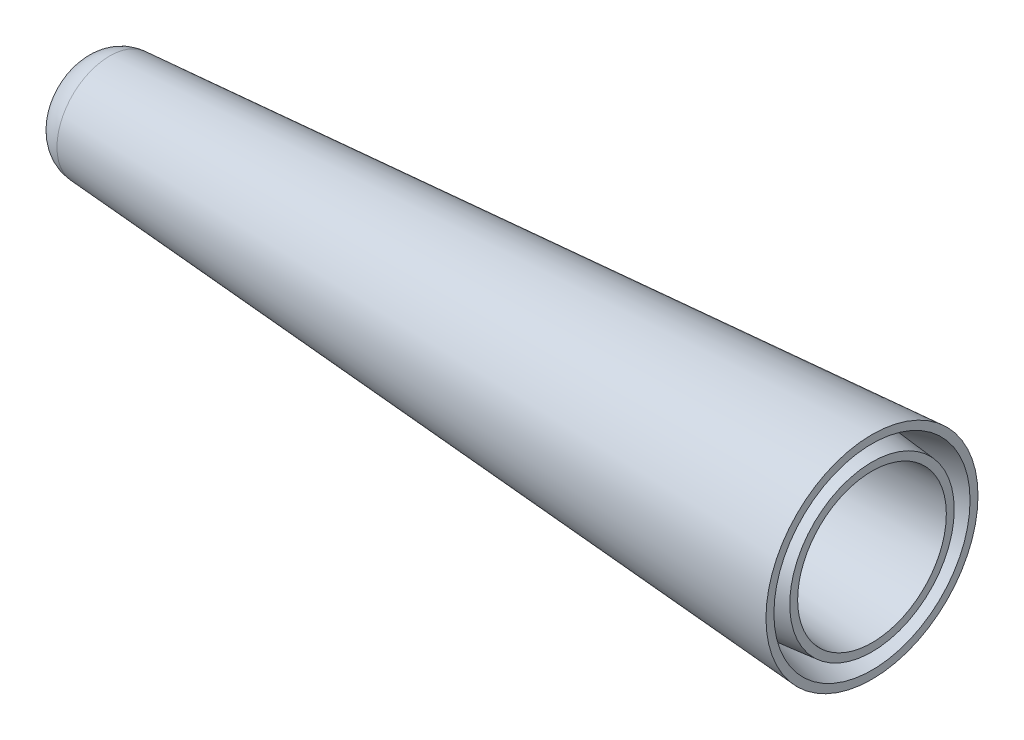
ISO-10303-21;
HEADER;
FILE_DESCRIPTION(('STEP AP214'),'2;1');
FILE_NAME('part.step','',(''),(''),'','','');
FILE_SCHEMA(('AUTOMOTIVE_DESIGN { 1 0 10303 214 1 1 1 1 }'));
ENDSEC;
DATA;
#1=APPLICATION_CONTEXT('core data for automotive mechanical design processes');
#2=APPLICATION_PROTOCOL_DEFINITION('international standard','automotive_design',2000,#1);
#3=PRODUCT_CONTEXT('',#1,'mechanical');
#4=PRODUCT('Part','Part','',(#3));
#5=PRODUCT_RELATED_PRODUCT_CATEGORY('part','',(#4));
#6=PRODUCT_DEFINITION_FORMATION('','',#4);
#7=PRODUCT_DEFINITION_CONTEXT('part definition',#1,'design');
#8=PRODUCT_DEFINITION('design','',#6,#7);
#9=PRODUCT_DEFINITION_SHAPE('','',#8);
#10=(LENGTH_UNIT() NAMED_UNIT(*) SI_UNIT(.MILLI.,.METRE.));
#11=(NAMED_UNIT(*) PLANE_ANGLE_UNIT() SI_UNIT($,.RADIAN.));
#12=(NAMED_UNIT(*) SI_UNIT($,.STERADIAN.) SOLID_ANGLE_UNIT());
#13=UNCERTAINTY_MEASURE_WITH_UNIT(LENGTH_MEASURE(1.E-05),#10,'distance_accuracy_value','');
#14=(GEOMETRIC_REPRESENTATION_CONTEXT(3) GLOBAL_UNCERTAINTY_ASSIGNED_CONTEXT((#13)) GLOBAL_UNIT_ASSIGNED_CONTEXT((#10,
#11,#12)) REPRESENTATION_CONTEXT('',''));
#15=CARTESIAN_POINT('',(0.,0.,0.));
#16=DIRECTION('',(0.,0.,1.));
#17=DIRECTION('',(1.,0.,0.));
#18=AXIS2_PLACEMENT_3D('',#15,#16,#17);
#19=CARTESIAN_POINT('',(50.,0.,0.));
#20=DIRECTION('',(1.,0.,0.));
#21=DIRECTION('',(0.,0.,-1.));
#22=AXIS2_PLACEMENT_3D('',#19,#20,#21);
#23=PLANE('',#22);
#24=CARTESIAN_POINT('',(50.,0.,0.));
#25=DIRECTION('',(1.,0.,0.));
#26=DIRECTION('',(0.,0.,-1.));
#27=AXIS2_PLACEMENT_3D('',#24,#25,#26);
#28=CIRCLE('',#27,6.69634059717554);
#29=CARTESIAN_POINT('',(50.,0.,-6.69634059717554));
#30=VERTEX_POINT('',#29);
#31=EDGE_CURVE('E79',#30,#30,#28,.T.);
#32=ORIENTED_EDGE('',*,*,#31,.T.);
#33=EDGE_LOOP('',(#32));
#34=FACE_BOUND('',#33,.T.);
#35=CARTESIAN_POINT('',(50.,0.,0.));
#36=DIRECTION('',(1.,0.,0.));
#37=DIRECTION('',(0.,0.,-1.));
#38=AXIS2_PLACEMENT_3D('',#35,#36,#37);
#39=CIRCLE('',#38,6.19511964813495);
#40=CARTESIAN_POINT('',(50.,0.,-6.19511964813495));
#41=VERTEX_POINT('',#40);
#42=EDGE_CURVE('E74',#41,#41,#39,.T.);
#43=ORIENTED_EDGE('',*,*,#42,.F.);
#44=EDGE_LOOP('',(#43));
#45=FACE_BOUND('',#44,.T.);
#46=ADVANCED_FACE('F44',(#34,#45),#23,.T.);
#47=CARTESIAN_POINT('',(50.,0.,-4.69512150857789));
#48=CARTESIAN_POINT('',(50.,-0.0775124416546671,-4.69512746288594));
#49=CARTESIAN_POINT('',(50.,-0.155028968040738,-4.69327686297905));
#50=CARTESIAN_POINT('',(50.,-0.30931134481741,-4.68582497437604));
#51=CARTESIAN_POINT('',(50.,-0.386078533048034,-4.68025127508642));
#52=CARTESIAN_POINT('',(50.,-0.538863254456393,-4.66535462510893));
#53=CARTESIAN_POINT('',(50.,-0.614882616948982,-4.65605051101887));
#54=CARTESIAN_POINT('',(50.,-0.766170717343436,-4.63370393037967));
#55=CARTESIAN_POINT('',(50.,-0.841440881345585,-4.62067112333707));
#56=CARTESIAN_POINT('',(50.,-0.991231339343665,-4.59087602482301));
#57=CARTESIAN_POINT('',(50.,-1.06575171069198,-4.57411412227401));
#58=CARTESIAN_POINT('',(50.,-1.21404396412532,-4.53687015375063));
#59=CARTESIAN_POINT('',(50.,-1.28781365743628,-4.51637937743146));
#60=CARTESIAN_POINT('',(50.,-1.43460737198423,-4.47168724214362));
#61=CARTESIAN_POINT('',(50.,-1.50762610167962,-4.4474685138979));
#62=CARTESIAN_POINT('',(50.,-1.65291974233676,-4.3953269502958));
#63=CARTESIAN_POINT('',(50.,-1.72518553597382,-4.36737874474295));
#64=CARTESIAN_POINT('',(50.,-1.86838013387628,-4.30804340648466));
#65=CARTESIAN_POINT('',(50.,-1.93930745247348,-4.27665268882305));
#66=CARTESIAN_POINT('',(50.,-2.07902804785243,-4.21069465735085));
#67=CARTESIAN_POINT('',(50.,-2.1478332545029,-4.17615264309091));
#68=CARTESIAN_POINT('',(50.,-2.28331023043661,-4.1038981770988));
#69=CARTESIAN_POINT('',(50.,-2.34999106743636,-4.06620273602421));
#70=CARTESIAN_POINT('',(50.,-2.48122277844722,-3.98765044707204));
#71=CARTESIAN_POINT('',(50.,-2.54577886178754,-3.94680230449715));
#72=CARTESIAN_POINT('',(50.,-2.67276507601446,-3.86195288319106));
#73=CARTESIAN_POINT('',(50.,-2.73519564748175,-3.81795226385479));
#74=CARTESIAN_POINT('',(50.,-2.85793564706415,-3.72680584703739));
#75=CARTESIAN_POINT('',(50.,-2.91823996076967,-3.67965316403947));
#76=CARTESIAN_POINT('',(50.,-3.03673378737065,-3.58221052759914));
#77=CARTESIAN_POINT('',(50.,-3.09491202106806,-3.53190686304264));
#78=CARTESIAN_POINT('',(50.,-3.20915750219905,-3.42816717417008));
#79=CARTESIAN_POINT('',(50.,-3.26520688012512,-3.37471148813813));
#80=CARTESIAN_POINT('',(50.,-3.37477531937602,-3.26511532154274));
#81=CARTESIAN_POINT('',(50.,-3.42829067725442,-3.20897113882781));
#82=CARTESIAN_POINT('',(50.,-3.53213446099675,-3.09456493858304));
#83=CARTESIAN_POINT('',(50.,-3.58248358815557,-3.03632172725161));
#84=CARTESIAN_POINT('',(50.,-3.67999745111359,-2.91772255544339));
#85=CARTESIAN_POINT('',(50.,-3.727177074484,-2.85737884109502));
#86=CARTESIAN_POINT('',(50.,-3.81835869480001,-2.73458577560312));
#87=CARTESIAN_POINT('',(50.,-3.86236883585799,-2.67214247353147));
#88=CARTESIAN_POINT('',(50.,-3.94721833551027,-2.54515631269986));
#89=CARTESIAN_POINT('',(50.,-3.98805835348872,-2.48061389453961));
#90=CARTESIAN_POINT('',(50.,-4.06657510242948,-2.34943502039702));
#91=CARTESIAN_POINT('',(50.,-4.10424447332359,-2.28279416022981));
#92=CARTESIAN_POINT('',(50.,-4.17642881210893,-2.14742327878113));
#93=CARTESIAN_POINT('',(50.,-4.21092811236186,-2.07868490644233));
#94=CARTESIAN_POINT('',(50.,-4.27677771378797,-1.93912207827003));
#95=CARTESIAN_POINT('',(50.,-4.30810398147676,-1.86828629574486));
#96=CARTESIAN_POINT('',(50.,-4.36739138271999,-1.72510261419097));
#97=CARTESIAN_POINT('',(50.,-4.39534767798401,-1.6527527120678));
#98=CARTESIAN_POINT('',(50.,-4.44750546696408,-1.50731586967257));
#99=CARTESIAN_POINT('',(50.,-4.47173328300328,-1.43423838201966));
#100=CARTESIAN_POINT('',(50.,-4.51643840698428,-1.28735009483453));
#101=CARTESIAN_POINT('',(50.,-4.53693415563886,-1.21354491202286));
#102=CARTESIAN_POINT('',(50.,-4.57418411661665,-1.06520521664913));
#103=CARTESIAN_POINT('',(50.,-4.59094816799818,-0.990673176083897));
#104=CARTESIAN_POINT('',(50.,-4.62074338418093,-0.840882763418078));
#105=CARTESIAN_POINT('',(50.,-4.63377532678387,-0.765624546043157));
#106=CARTESIAN_POINT('',(50.,-4.65611536227887,-0.6143840101421));
#107=CARTESIAN_POINT('',(50.,-4.66541496994597,-0.538400439255876));
#108=CARTESIAN_POINT('',(50.,-4.68030040956254,-0.385710302058013));
#109=CARTESIAN_POINT('',(50.,-4.68586857069038,-0.309002016121043));
#110=CARTESIAN_POINT('',(50.,-4.69329728755643,-0.154863224179588));
#111=CARTESIAN_POINT('',(50.,-4.69513130471307,-0.077431450892796));
#112=CARTESIAN_POINT('',(50.,-4.69511169854175,0.0775413280883679));
#113=CARTESIAN_POINT('',(50.,-4.69325283866525,0.15508233286712));
#114=CARTESIAN_POINT('',(50.,-4.68578408232483,0.309408376540803));
#115=CARTESIAN_POINT('',(50.,-4.68020212187726,0.386194755471347));
#116=CARTESIAN_POINT('',(50.,-4.66529255700744,0.539009747856804));
#117=CARTESIAN_POINT('',(50.,-4.65598413900821,0.615040229093841));
#118=CARTESIAN_POINT('',(50.,-4.63363147176082,0.766343180431094));
#119=CARTESIAN_POINT('',(50.,-4.6205972586095,0.84161713194866));
#120=CARTESIAN_POINT('',(50.,-4.59080213975315,0.991407563973905));
#121=CARTESIAN_POINT('',(50.,-4.57404201185416,1.06592419918554));
#122=CARTESIAN_POINT('',(50.,-4.53680426601222,1.21420139625289));
#123=CARTESIAN_POINT('',(50.,-4.51631832948614,1.28795986798344));
#124=CARTESIAN_POINT('',(50.,-4.47163869668915,1.43472357168149));
#125=CARTESIAN_POINT('',(50.,-4.44742801663569,1.50772363004496));
#126=CARTESIAN_POINT('',(50.,-4.39530489414029,1.65297215195386));
#127=CARTESIAN_POINT('',(50.,-4.36736744827808,1.72521163043999));
#128=CARTESIAN_POINT('',(50.,-4.30804381955395,1.86838030608011));
#129=CARTESIAN_POINT('',(50.,-4.27665279910239,1.9393074984478));
#130=CARTESIAN_POINT('',(50.,-4.21069454788966,2.07902800221964));
#131=CARTESIAN_POINT('',(50.,-4.17615261383278,2.14783324230587));
#132=CARTESIAN_POINT('',(50.,-4.10389820620791,2.2833102425723));
#133=CARTESIAN_POINT('',(50.,-4.06620274381417,2.34999107068438));
#134=CARTESIAN_POINT('',(50.,-3.98765043930252,2.48122277520871));
#135=CARTESIAN_POINT('',(50.,-3.94680230241519,2.54577886092012));
#136=CARTESIAN_POINT('',(50.,-3.8619528852722,2.6727650768826));
#137=CARTESIAN_POINT('',(50.,-3.81795226441298,2.73519564771497));
#138=CARTESIAN_POINT('',(50.,-3.72680584647759,2.85793564683125));
#139=CARTESIAN_POINT('',(50.,-3.679653163889,2.91823996070738));
#140=CARTESIAN_POINT('',(50.,-3.58221052775005,3.0367337874339));
#141=CARTESIAN_POINT('',(50.,-3.53190686308314,3.09491202108524));
#142=CARTESIAN_POINT('',(50.,-3.42816717412914,3.20915750218214));
#143=CARTESIAN_POINT('',(50.,-3.37471148812714,3.26520688012062));
#144=CARTESIAN_POINT('',(50.,-3.2651153215536,3.37477531938067));
#145=CARTESIAN_POINT('',(50.,-3.2089711388305,3.42829067725581));
#146=CARTESIAN_POINT('',(50.,-3.09456493857968,3.53213446099584));
#147=CARTESIAN_POINT('',(50.,-3.03632172725029,3.58248358815561));
#148=CARTESIAN_POINT('',(50.,-2.9177225554435,3.67999745111436));
#149=CARTESIAN_POINT('',(50.,-2.8573788410945,3.72717707448457));
#150=CARTESIAN_POINT('',(50.,-2.73458577560212,3.81835869480046));
#151=CARTESIAN_POINT('',(50.,-2.6721424735306,3.86236883585851));
#152=CARTESIAN_POINT('',(50.,-2.54515631269911,3.94721833551084));
#153=CARTESIAN_POINT('',(50.,-2.48061389453883,3.98805835348926));
#154=CARTESIAN_POINT('',(50.,-2.34943502039628,4.06657510242997));
#155=CARTESIAN_POINT('',(50.,-2.28279416022914,4.10424447332404));
#156=CARTESIAN_POINT('',(50.,-2.1474232787806,4.17642881210929));
#157=CARTESIAN_POINT('',(50.,-2.07868490644188,4.21092811236217));
#158=CARTESIAN_POINT('',(50.,-1.93912207826978,4.27677771378814));
#159=CARTESIAN_POINT('',(50.,-1.86828629574473,4.30810398147684));
#160=CARTESIAN_POINT('',(50.,-1.72510261419089,4.36739138271999));
#161=CARTESIAN_POINT('',(50.,-1.65275271206764,4.39534767798401));
#162=CARTESIAN_POINT('',(50.,-1.50731586967228,4.44750546696408));
#163=CARTESIAN_POINT('',(50.,-1.43423838201932,4.47173328300328));
#164=CARTESIAN_POINT('',(50.,-1.28735009483411,4.51643840698427));
#165=CARTESIAN_POINT('',(50.,-1.2135449120224,4.53693415563886));
#166=CARTESIAN_POINT('',(50.,-1.06520521664864,4.57418411661665));
#167=CARTESIAN_POINT('',(50.,-0.99067317608339,4.59094816799817));
#168=CARTESIAN_POINT('',(50.,-0.840882763417571,4.62074338418092));
#169=CARTESIAN_POINT('',(50.,-0.765624546042661,4.63377532678387));
#170=CARTESIAN_POINT('',(50.,-0.614384010141647,4.65611536227887));
#171=CARTESIAN_POINT('',(50.,-0.538400439255456,4.66541496994597));
#172=CARTESIAN_POINT('',(50.,-0.385710302057679,4.68030040956254));
#173=CARTESIAN_POINT('',(50.,-0.309002016120763,4.68586857069038));
#174=CARTESIAN_POINT('',(50.,-0.154863224179438,4.69329728755643));
#175=CARTESIAN_POINT('',(50.,-0.0774314508927208,4.69513130471307));
#176=CARTESIAN_POINT('',(50.,0.0775413280882918,4.69511169854175));
#177=CARTESIAN_POINT('',(50.,0.155082332866968,4.69325283866525));
#178=CARTESIAN_POINT('',(50.,0.309408376540521,4.68578408232483));
#179=CARTESIAN_POINT('',(50.,0.386194755471011,4.68020212187726));
#180=CARTESIAN_POINT('',(50.,0.539009747856382,4.66529255700744));
#181=CARTESIAN_POINT('',(50.,0.615040229093385,4.6559841390082));
#182=CARTESIAN_POINT('',(50.,0.766343180430595,4.63363147176082));
#183=CARTESIAN_POINT('',(50.,0.84161713194815,4.6205972586095));
#184=CARTESIAN_POINT('',(50.,0.991407563973395,4.59080213975315));
#185=CARTESIAN_POINT('',(50.,1.06592419918504,4.57404201185416));
#186=CARTESIAN_POINT('',(50.,1.21420139625243,4.53680426601222));
#187=CARTESIAN_POINT('',(50.,1.28795986798301,4.51631832948614));
#188=CARTESIAN_POINT('',(50.,1.43472357168115,4.47163869668915));
#189=CARTESIAN_POINT('',(50.,1.50772363004468,4.44742801663568));
#190=CARTESIAN_POINT('',(50.,1.65297215195371,4.39530489414029));
#191=CARTESIAN_POINT('',(50.,1.72521163043991,4.36736744827808));
#192=CARTESIAN_POINT('',(50.,1.86838030608002,4.30804381955402));
#193=CARTESIAN_POINT('',(50.,1.93930749844763,4.27665279910253));
#194=CARTESIAN_POINT('',(50.,2.07902800221931,4.21069454788991));
#195=CARTESIAN_POINT('',(50.,2.14783324230549,4.17615261383309));
#196=CARTESIAN_POINT('',(50.,2.28331024257181,4.10389820620829));
#197=CARTESIAN_POINT('',(50.,2.34999107068385,4.06620274381458));
#198=CARTESIAN_POINT('',(50.,2.48122277520814,3.98765043930297));
#199=CARTESIAN_POINT('',(50.,2.54577886091954,3.94680230241565));
#200=CARTESIAN_POINT('',(50.,2.67276507688201,3.86195288527266));
#201=CARTESIAN_POINT('',(50.,2.73519564771439,3.81795226441342));
#202=CARTESIAN_POINT('',(50.,2.85793564683073,3.72680584647799));
#203=CARTESIAN_POINT('',(50.,2.91823996070689,3.67965316388938));
#204=CARTESIAN_POINT('',(50.,3.03673378743352,3.58221052775035));
#205=CARTESIAN_POINT('',(50.,3.09491202108492,3.53190686308339));
#206=CARTESIAN_POINT('',(50.,3.20915750218196,3.42816717412927));
#207=CARTESIAN_POINT('',(50.,3.26520688012053,3.37471148812721));
#208=CARTESIAN_POINT('',(50.,3.37477531938064,3.26511532155365));
#209=CARTESIAN_POINT('',(50.,3.42829067725573,3.20897113883061));
#210=CARTESIAN_POINT('',(50.,3.5321344609957,3.09456493857989));
#211=CARTESIAN_POINT('',(50.,3.58248358815544,3.03632172725055));
#212=CARTESIAN_POINT('',(50.,3.67999745111415,2.91772255544381));
#213=CARTESIAN_POINT('',(50.,3.72717707448435,2.85737884109484));
#214=CARTESIAN_POINT('',(50.,3.81835869480021,2.73458577560249));
#215=CARTESIAN_POINT('',(50.,3.86236883585826,2.67214247353098));
#216=CARTESIAN_POINT('',(50.,3.94721833551059,2.54515631269949));
#217=CARTESIAN_POINT('',(50.,3.98805835348902,2.48061389453921));
#218=CARTESIAN_POINT('',(50.,4.06657510242974,2.34943502039662));
#219=CARTESIAN_POINT('',(50.,4.10424447332384,2.28279416022945));
#220=CARTESIAN_POINT('',(50.,4.17642881210913,2.14742327878085));
#221=CARTESIAN_POINT('',(50.,4.21092811236203,2.07868490644209));
#222=CARTESIAN_POINT('',(50.,4.27677771378806,1.9391220782699));
#223=CARTESIAN_POINT('',(50.,4.30810398147681,1.86828629574479));
#224=CARTESIAN_POINT('',(50.,4.36739138271999,1.72510261419092));
#225=CARTESIAN_POINT('',(50.,4.39534767798401,1.65275271206771));
#226=CARTESIAN_POINT('',(50.,4.44750546696408,1.50731586967241));
#227=CARTESIAN_POINT('',(50.,4.47173328300328,1.43423838201946));
#228=CARTESIAN_POINT('',(50.,4.51643840698427,1.28735009483429));
#229=CARTESIAN_POINT('',(50.,4.53693415563886,1.2135449120226));
#230=CARTESIAN_POINT('',(50.,4.57418411661665,1.06520521664885));
#231=CARTESIAN_POINT('',(50.,4.59094816799817,0.99067317608361));
#232=CARTESIAN_POINT('',(50.,4.62074338418093,0.84088276341779));
#233=CARTESIAN_POINT('',(50.,4.63377532678387,0.765624546042876));
#234=CARTESIAN_POINT('',(50.,4.65611536227887,0.614384010141844));
#235=CARTESIAN_POINT('',(50.,4.66541496994597,0.538400439255638));
#236=CARTESIAN_POINT('',(50.,4.68030040956254,0.385710302057824));
#237=CARTESIAN_POINT('',(50.,4.68586857069038,0.309002016120885));
#238=CARTESIAN_POINT('',(50.,4.69329728755643,0.154863224179503));
#239=CARTESIAN_POINT('',(50.,4.69513130471307,0.077431450892754));
#240=CARTESIAN_POINT('',(50.,4.69511169854175,-0.0775413280883341));
#241=CARTESIAN_POINT('',(50.,4.69325283866525,-0.155082332867053));
#242=CARTESIAN_POINT('',(50.,4.68578408232483,-0.309408376540679));
#243=CARTESIAN_POINT('',(50.,4.68020212187726,-0.3861947554712));
#244=CARTESIAN_POINT('',(50.,4.66529255700744,-0.53900974785662));
#245=CARTESIAN_POINT('',(50.,4.65598413900821,-0.615040229093642));
#246=CARTESIAN_POINT('',(50.,4.63363147176082,-0.766343180430876));
#247=CARTESIAN_POINT('',(50.,4.6205972586095,-0.841617131948437));
#248=CARTESIAN_POINT('',(50.,4.59080213975315,-0.991407563973682));
#249=CARTESIAN_POINT('',(50.,4.57404201185416,-1.06592419918533));
#250=CARTESIAN_POINT('',(50.,4.53680426601222,-1.21420139625269));
#251=CARTESIAN_POINT('',(50.,4.51631832948614,-1.28795986798325));
#252=CARTESIAN_POINT('',(50.,4.47163869668915,-1.43472357168134));
#253=CARTESIAN_POINT('',(50.,4.44742801663569,-1.50772363004483));
#254=CARTESIAN_POINT('',(50.,4.39530489414029,-1.65297215195379));
#255=CARTESIAN_POINT('',(50.,4.36736744827808,-1.72521163043995));
#256=CARTESIAN_POINT('',(50.,4.30804381955396,-1.86838030608012));
#257=CARTESIAN_POINT('',(50.,4.27665279910241,-1.93930749844782));
#258=CARTESIAN_POINT('',(50.,4.2106945478897,-2.07902800221967));
#259=CARTESIAN_POINT('',(50.,4.17615261383283,-2.14783324230592));
#260=CARTESIAN_POINT('',(50.,4.10389820620797,-2.28331024257235));
#261=CARTESIAN_POINT('',(50.,4.06620274381422,-2.34999107068442));
#262=CARTESIAN_POINT('',(50.,3.98765043930259,-2.4812227752088));
#263=CARTESIAN_POINT('',(50.,3.94680230241528,-2.54577886092025));
#264=CARTESIAN_POINT('',(50.,3.86195288527225,-2.67276507688261));
#265=CARTESIAN_POINT('',(50.,3.81795226441296,-2.73519564771483));
#266=CARTESIAN_POINT('',(50.,3.72680584647773,-2.85793564683152));
#267=CARTESIAN_POINT('',(50.,3.67965316388938,-2.91823996070821));
#268=CARTESIAN_POINT('',(50.,3.58221052774977,-3.03673378743318));
#269=CARTESIAN_POINT('',(50.,3.53190686308197,-3.09491202108239));
#270=CARTESIAN_POINT('',(50.,3.42816717413037,-3.20915750218508));
#271=CARTESIAN_POINT('',(50.,3.37471148813169,-3.26520688013156));
#272=CARTESIAN_POINT('',(50.,3.26511532154908,-3.37477531936968));
#273=CARTESIAN_POINT('',(50.,3.20897113881356,-3.42829067721484));
#274=CARTESIAN_POINT('',(50.,3.09456493859665,-3.53213446103621));
#275=CARTESIAN_POINT('',(50.,3.03632172731316,-3.58248358830625));
#276=CARTESIAN_POINT('',(50.,2.91772255538123,-3.67999745096399));
#277=CARTESIAN_POINT('',(50.,2.85737884086232,-3.72717707392558));
#278=CARTESIAN_POINT('',(50.,2.73458577583404,-3.81835869535734));
#279=CARTESIAN_POINT('',(50.,2.67214247439441,-3.86236883793473));
#280=CARTESIAN_POINT('',(50.,2.54515631183587,-3.94721833343439));
#281=CARTESIAN_POINT('',(50.,2.48061389131729,-3.9880583457423));
#282=CARTESIAN_POINT('',(50.,2.34943502362547,-4.06657511019382));
#283=CARTESIAN_POINT('',(50.,2.28279417229262,-4.10424450232997));
#284=CARTESIAN_POINT('',(50.,2.14742326666067,-4.17642878296646));
#285=CARTESIAN_POINT('',(50.,2.07868486110722,-4.21092800335479));
#286=CARTESIAN_POINT('',(50.,1.93912212392569,-4.27677782356728));
#287=CARTESIAN_POINT('',(50.,1.86828646672253,-4.30810439259191));
#288=CARTESIAN_POINT('',(50.,1.72512869039417,-4.36738010304966));
#289=CARTESIAN_POINT('',(50.,1.65280508571756,-4.39532565627679));
#290=CARTESIAN_POINT('',(50.,1.50741332942991,-4.44746503631701));
#291=CARTESIAN_POINT('',(50.,1.43435449893985,-4.47168482052722));
#292=CARTESIAN_POINT('',(50.,1.28749620492464,-4.51637745343878));
#293=CARTESIAN_POINT('',(50.,1.213702240403,-4.53686835826448));
#294=CARTESIAN_POINT('',(50.,1.06537757810596,-4.57411213887261));
#295=CARTESIAN_POINT('',(50.,0.990849253858552,-4.59087446234744));
#296=CARTESIAN_POINT('',(50.,0.841058913887476,-4.62066957845393));
#297=CARTESIAN_POINT('',(50.,0.76579697551787,-4.63370275998921));
#298=CARTESIAN_POINT('',(50.,0.614541424083018,-4.65604932218945));
#299=CARTESIAN_POINT('',(50.,0.538546502530484,-4.66535384235011));
#300=CARTESIAN_POINT('',(50.,0.385826771823269,-4.68025048931462));
#301=CARTESIAN_POINT('',(50.,0.309100210130943,-4.68582458036986));
#302=CARTESIAN_POINT('',(50.,0.154915312597304,-4.69327648573209));
#303=CARTESIAN_POINT('',(50.,0.0774556761758535,-4.69512749262268));
#304=CARTESIAN_POINT('',(50.,0.,-4.69512150857789));
#305=B_SPLINE_CURVE_WITH_KNOTS('',3,(#47,#48,#49,#50,#51,#52,#53,#54,#55,#56,#57,#58,#59,#60,
#61,#62,#63,#64,#65,#66,#67,#68,#69,#70,#71,#72,#73,#74,#75,#76,#77,#78,#79,#80,#81,#82,#83,#84,
#85,#86,#87,#88,#89,#90,#91,#92,#93,#94,#95,#96,#97,#98,#99,#100,#101,#102,#103,#104,#105,#106,
#107,#108,#109,#110,#111,#112,#113,#114,#115,#116,#117,#118,#119,#120,#121,#122,#123,#124,#125,
#126,#127,#128,#129,#130,#131,#132,#133,#134,#135,#136,#137,#138,#139,#140,#141,#142,#143,#144,
#145,#146,#147,#148,#149,#150,#151,#152,#153,#154,#155,#156,#157,#158,#159,#160,#161,#162,#163,
#164,#165,#166,#167,#168,#169,#170,#171,#172,#173,#174,#175,#176,#177,#178,#179,#180,#181,#182,
#183,#184,#185,#186,#187,#188,#189,#190,#191,#192,#193,#194,#195,#196,#197,#198,#199,#200,#201,
#202,#203,#204,#205,#206,#207,#208,#209,#210,#211,#212,#213,#214,#215,#216,#217,#218,#219,#220,
#221,#222,#223,#224,#225,#226,#227,#228,#229,#230,#231,#232,#233,#234,#235,#236,#237,#238,#239,
#240,#241,#242,#243,#244,#245,#246,#247,#248,#249,#250,#251,#252,#253,#254,#255,#256,#257,#258,
#259,#260,#261,#262,#263,#264,#265,#266,#267,#268,#269,#270,#271,#272,#273,#274,#275,#276,#277,
#278,#279,#280,#281,#282,#283,#284,#285,#286,#287,#288,#289,#290,#291,#292,#293,#294,#295,#296,
#297,#298,#299,#300,#301,#302,#303,#304),.UNSPECIFIED.,.F.,.F.,(4,2,2,2,2,2,2,2,2,2,2,2,2,2,2,2,
2,2,2,2,2,2,2,2,2,2,2,2,2,2,2,2,2,2,2,2,2,2,2,2,2,2,2,2,2,2,2,2,2,2,2,2,2,2,2,2,2,2,2,2,2,2,2,2,
2,2,2,2,2,2,2,2,2,2,2,2,2,2,2,2,2,2,2,2,2,2,2,2,2,2,2,2,2,2,2,2,2,2,2,2,2,2,2,2,2,2,2,2,2,2,2,2,
2,2,2,2,2,2,2,2,2,2,2,2,2,2,2,2,4),(0.,0.232520959143622,0.463337698024182,0.693003325785943,
0.922079289877141,1.15113137389905,1.38072553799434,1.6114237527681,1.84377997828047,
2.0763805143528,2.30725509395296,2.53695595019063,2.76604380437203,2.99508387998524,
3.22464175344358,3.45527919191116,3.68755012962269,3.92015066569469,4.15102524529462,
4.38072610153215,4.6098139557135,4.83885403132675,5.06841190478525,5.29904934325305,
5.53132028096492,5.76392081703683,5.9947953966367,6.22449625287419,6.45358410705552,
6.68262418266879,6.91218205612732,7.14281949459521,7.37509043230718,7.60769096837942,
7.83856554797953,8.06826640421716,8.29735425839855,8.52639433401177,8.75595220747016,
8.98658964593781,9.21886058364946,9.451461119722,9.68233569932232,9.91203655556009,
10.1411244097415,10.3701644853547,10.5997223588129,10.8303597972804,11.0626307349917,
11.2952312710641,11.5261058506644,11.7558067069021,11.9848945610835,12.2139346366967,
12.443492510155,12.6741299486225,12.9064008863339,13.1390014224061,13.3698760020061,
13.5995768582437,13.828664712425,14.0577047880383,14.2872626614967,14.5179000999644,
14.7501710376762,14.9827715737482,15.2136461533481,15.4433470095857,15.672434863767,
15.9014749393803,16.1310328128388,16.3616702513066,16.5939411890184,16.8265417250906,
17.0574163046907,17.2871171609284,17.5162050151097,17.745245090723,17.9748029641814,
18.205440402649,18.4377113403607,18.6703118764329,18.901186456033,19.1308873122706,
19.359975166452,19.5890152420652,19.8185731155236,20.0492105539913,20.2814814917029,
20.5140820277749,20.7449566073749,20.9746574636124,21.2037453177938,21.432785393407,
21.6623432668655,21.8929807053333,22.1252516430451,22.3578521791173,22.5887267587173,
22.8184276149549,23.0475154691363,23.2765555447495,23.506113418208,23.7367508566757,
23.9690217943874,24.20162233046,24.4324969100603,24.6621977662981,24.8912856204795,
25.1203256960927,25.3498835695509,25.5805210080184,25.8127919457297,26.045392481802,
26.2762670614021,26.5059679176397,26.7350557718211,26.9640958474343,27.1936537208927,
27.4242911593603,27.6565620970719,27.8890774163845,28.1198912696329,28.349555864391,
28.5786317195503,28.8076836762025,29.0372767518232,29.267971988006,29.5003224425342),.UNSPECIFIED.);
#306=CARTESIAN_POINT('',(50.,0.,-4.69512150857789));
#307=VERTEX_POINT('',#306);
#308=EDGE_CURVE('E55',#307,#307,#305,.T.);
#309=ORIENTED_EDGE('',*,*,#308,.T.);
#310=EDGE_LOOP('',(#309));
#311=FACE_BOUND('',#310,.T.);
#312=CARTESIAN_POINT('',(50.,0.,0.));
#313=DIRECTION('',(1.,0.,0.));
#314=DIRECTION('',(0.,0.,-1.));
#315=AXIS2_PLACEMENT_3D('',#312,#313,#314);
#316=CIRCLE('',#315,5.19634059717554);
#317=CARTESIAN_POINT('',(50.,0.,-5.19634059717554));
#318=VERTEX_POINT('',#317);
#319=EDGE_CURVE('E113',#318,#318,#316,.T.);
#320=ORIENTED_EDGE('',*,*,#319,.T.);
#321=EDGE_LOOP('',(#320));
#322=FACE_BOUND('',#321,.T.);
#323=ADVANCED_FACE('F70',(#311,#322),#23,.T.);
#324=CARTESIAN_POINT('',(1.99026806874157,0.,0.));
#325=DIRECTION('',(-1.,0.,0.));
#326=DIRECTION('',(0.,0.,1.));
#327=AXIS2_PLACEMENT_3D('',#324,#325,#326);
#328=DEGENERATE_TOROIDAL_SURFACE('',#327,1.33917310096007,1.99512810051965,.T.);
#329=CARTESIAN_POINT('',(0.,0.,0.));
#330=DIRECTION('',(-1.,0.,0.));
#331=DIRECTION('',(0.,0.,1.));
#332=AXIS2_PLACEMENT_3D('',#329,#330,#331);
#333=CIRCLE('',#332,1.2);
#334=CARTESIAN_POINT('',(0.,0.,1.2));
#335=VERTEX_POINT('',#334);
#336=EDGE_CURVE('E61',#335,#335,#333,.T.);
#337=ORIENTED_EDGE('',*,*,#336,.F.);
#338=EDGE_LOOP('',(#337));
#339=FACE_BOUND('',#338,.T.);
#340=CARTESIAN_POINT('',(1.85109496778151,0.,0.));
#341=DIRECTION('',(-1.,0.,0.));
#342=DIRECTION('',(0.,0.,1.));
#343=AXIS2_PLACEMENT_3D('',#340,#341,#342);
#344=CIRCLE('',#343,3.32944116970164);
#345=CARTESIAN_POINT('',(1.85109496778151,0.,3.32944116970164));
#346=VERTEX_POINT('',#345);
#347=EDGE_CURVE('E11',#346,#346,#344,.T.);
#348=ORIENTED_EDGE('',*,*,#347,.T.);
#349=EDGE_LOOP('',(#348));
#350=FACE_BOUND('',#349,.T.);
#351=ADVANCED_FACE('F46',(#339,#350),#328,.T.);
#352=CARTESIAN_POINT('',(50.,0.,0.));
#353=DIRECTION('',(1.,0.,0.));
#354=DIRECTION('',(0.,0.,-1.));
#355=AXIS2_PLACEMENT_3D('',#352,#353,#354);
#356=CONICAL_SURFACE('',#355,6.69634059717554,0.0698131700797735);
#357=ORIENTED_EDGE('',*,*,#347,.F.);
#358=EDGE_LOOP('',(#357));
#359=FACE_BOUND('',#358,.T.);
#360=ORIENTED_EDGE('',*,*,#31,.F.);
#361=EDGE_LOOP('',(#360));
#362=FACE_BOUND('',#361,.T.);
#363=ADVANCED_FACE('F93',(#359,#362),#356,.T.);
#364=CARTESIAN_POINT('',(0.,0.,0.));
#365=DIRECTION('',(1.,0.,0.));
#366=DIRECTION('',(0.,0.,-1.));
#367=AXIS2_PLACEMENT_3D('',#364,#365,#366);
#368=CONICAL_SURFACE('',#367,1.2,0.0698131700797735);
#369=ORIENTED_EDGE('',*,*,#308,.F.);
#370=EDGE_LOOP('',(#369));
#371=FACE_BOUND('',#370,.T.);
#372=ORIENTED_EDGE('',*,*,#336,.T.);
#373=EDGE_LOOP('',(#372));
#374=FACE_BOUND('',#373,.T.);
#375=ADVANCED_FACE('F66',(#371,#374),#368,.F.);
#376=CARTESIAN_POINT('',(50.,0.,0.));
#377=DIRECTION('',(1.,0.,0.));
#378=DIRECTION('',(0.,0.,-1.));
#379=AXIS2_PLACEMENT_3D('',#376,#377,#378);
#380=CONICAL_SURFACE('',#379,6.19511964813495,0.23270688178031);
#381=CARTESIAN_POINT('',(47.,0.,0.));
#382=DIRECTION('',(1.,0.,0.));
#383=DIRECTION('',(0.,0.,-1.));
#384=AXIS2_PLACEMENT_3D('',#381,#382,#383);
#385=CIRCLE('',#384,5.48411826326383);
#386=CARTESIAN_POINT('',(47.,0.,-5.48411826326383));
#387=VERTEX_POINT('',#386);
#388=EDGE_CURVE('E108',#387,#387,#385,.T.);
#389=ORIENTED_EDGE('',*,*,#388,.F.);
#390=EDGE_LOOP('',(#389));
#391=FACE_BOUND('',#390,.T.);
#392=ORIENTED_EDGE('',*,*,#42,.T.);
#393=EDGE_LOOP('',(#392));
#394=FACE_BOUND('',#393,.T.);
#395=ADVANCED_FACE('F89',(#391,#394),#380,.F.);
#396=CARTESIAN_POINT('',(47.,0.,0.));
#397=DIRECTION('',(-1.,0.,0.));
#398=DIRECTION('',(0.,0.,1.));
#399=AXIS2_PLACEMENT_3D('',#396,#397,#398);
#400=CONICAL_SURFACE('',#399,5.48411826326383,0.0956332730379782);
#401=ORIENTED_EDGE('',*,*,#319,.F.);
#402=EDGE_LOOP('',(#401));
#403=FACE_BOUND('',#402,.T.);
#404=ORIENTED_EDGE('',*,*,#388,.T.);
#405=EDGE_LOOP('',(#404));
#406=FACE_BOUND('',#405,.T.);
#407=ADVANCED_FACE('F121',(#403,#406),#400,.T.);
#408=CLOSED_SHELL('',(#46,#323,#351,#363,#375,#395,#407));
#409=MANIFOLD_SOLID_BREP('B2',#408);
#410=ADVANCED_BREP_SHAPE_REPRESENTATION('',(#18,#409),#14);
#411=SHAPE_DEFINITION_REPRESENTATION(#9,#410);
ENDSEC;
END-ISO-10303-21;
